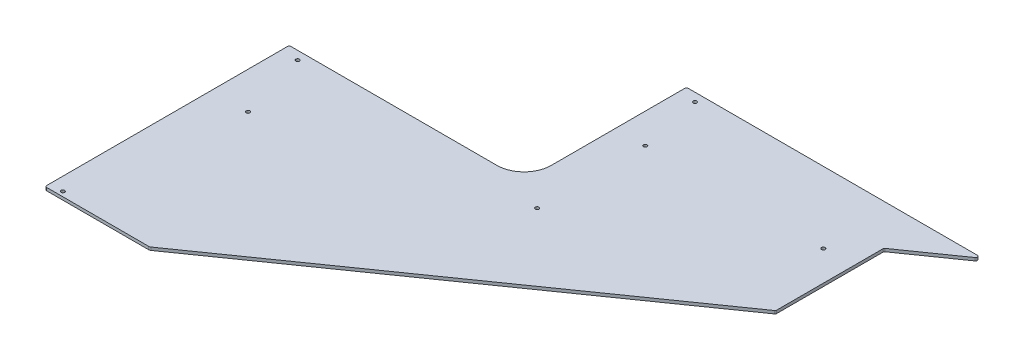
ISO-10303-21;
HEADER;
FILE_DESCRIPTION(('STEP AP214'),'2;1');
FILE_NAME('part.step','',(''),(''),'','','');
FILE_SCHEMA(('AUTOMOTIVE_DESIGN { 1 0 10303 214 1 1 1 1 }'));
ENDSEC;
DATA;
#1=APPLICATION_CONTEXT('core data for automotive mechanical design processes');
#2=APPLICATION_PROTOCOL_DEFINITION('international standard','automotive_design',2000,#1);
#3=PRODUCT_CONTEXT('',#1,'mechanical');
#4=PRODUCT('Part','Part','',(#3));
#5=PRODUCT_RELATED_PRODUCT_CATEGORY('part','',(#4));
#6=PRODUCT_DEFINITION_FORMATION('','',#4);
#7=PRODUCT_DEFINITION_CONTEXT('part definition',#1,'design');
#8=PRODUCT_DEFINITION('design','',#6,#7);
#9=PRODUCT_DEFINITION_SHAPE('','',#8);
#10=(LENGTH_UNIT() NAMED_UNIT(*) SI_UNIT(.MILLI.,.METRE.));
#11=(NAMED_UNIT(*) PLANE_ANGLE_UNIT() SI_UNIT($,.RADIAN.));
#12=(NAMED_UNIT(*) SI_UNIT($,.STERADIAN.) SOLID_ANGLE_UNIT());
#13=UNCERTAINTY_MEASURE_WITH_UNIT(LENGTH_MEASURE(1.E-05),#10,'distance_accuracy_value','');
#14=(GEOMETRIC_REPRESENTATION_CONTEXT(3) GLOBAL_UNCERTAINTY_ASSIGNED_CONTEXT((#13)) GLOBAL_UNIT_ASSIGNED_CONTEXT((#10,
#11,#12)) REPRESENTATION_CONTEXT('',''));
#15=CARTESIAN_POINT('',(0.,0.,0.));
#16=DIRECTION('',(0.,0.,1.));
#17=DIRECTION('',(1.,0.,0.));
#18=AXIS2_PLACEMENT_3D('',#15,#16,#17);
#19=CARTESIAN_POINT('',(0.,5.588,0.));
#20=DIRECTION('',(1.,0.,0.));
#21=DIRECTION('',(0.,0.,-1.));
#22=AXIS2_PLACEMENT_3D('',#19,#20,#21);
#23=PLANE('',#22);
#24=DIRECTION('',(0.,1.,0.));
#25=VECTOR('',#24,1.);
#26=CARTESIAN_POINT('',(0.,0.,-15.875));
#27=LINE('',#26,#25);
#28=CARTESIAN_POINT('',(0.,0.,-15.875));
#29=VERTEX_POINT('',#28);
#30=CARTESIAN_POINT('',(0.,5.588,-15.875));
#31=VERTEX_POINT('',#30);
#32=EDGE_CURVE('E284',#29,#31,#27,.T.);
#33=ORIENTED_EDGE('',*,*,#32,.T.);
#34=DIRECTION('',(0.,0.,1.));
#35=VECTOR('',#34,1.);
#36=CARTESIAN_POINT('',(0.,5.588,0.));
#37=LINE('',#36,#35);
#38=CARTESIAN_POINT('',(0.,5.588,-466.725));
#39=VERTEX_POINT('',#38);
#40=EDGE_CURVE('E184',#39,#31,#37,.T.);
#41=ORIENTED_EDGE('',*,*,#40,.F.);
#42=DIRECTION('',(0.,-1.,0.));
#43=VECTOR('',#42,1.);
#44=CARTESIAN_POINT('',(0.,5.588,-466.725));
#45=LINE('',#44,#43);
#46=CARTESIAN_POINT('',(0.,0.,-466.725));
#47=VERTEX_POINT('',#46);
#48=EDGE_CURVE('E240',#39,#47,#45,.T.);
#49=ORIENTED_EDGE('',*,*,#48,.T.);
#50=DIRECTION('',(0.,0.,1.));
#51=VECTOR('',#50,1.);
#52=CARTESIAN_POINT('',(0.,0.,0.));
#53=LINE('',#52,#51);
#54=EDGE_CURVE('E197',#47,#29,#53,.T.);
#55=ORIENTED_EDGE('',*,*,#54,.T.);
#56=EDGE_LOOP('',(#33,#41,#49,#55));
#57=FACE_BOUND('',#56,.T.);
#58=ADVANCED_FACE('F33',(#57),#23,.F.);
#59=CARTESIAN_POINT('',(0.,5.588,0.));
#60=DIRECTION('',(0.,-1.,0.));
#61=DIRECTION('',(0.,0.,-1.));
#62=AXIS2_PLACEMENT_3D('',#59,#60,#61);
#63=PLANE('',#62);
#64=CARTESIAN_POINT('',(471.4875,5.588,-758.063));
#65=DIRECTION('',(0.,1.,0.));
#66=DIRECTION('',(0.,0.,1.));
#67=AXIS2_PLACEMENT_3D('',#64,#65,#66);
#68=CIRCLE('',#67,3.37819999999999);
#69=CARTESIAN_POINT('',(471.4875,5.588,-754.6848));
#70=VERTEX_POINT('',#69);
#71=EDGE_CURVE('E557',#70,#70,#68,.T.);
#72=ORIENTED_EDGE('',*,*,#71,.F.);
#73=EDGE_LOOP('',(#72));
#74=FACE_BOUND('',#73,.T.);
#75=CARTESIAN_POINT('',(31.75,5.588,-454.025));
#76=DIRECTION('',(0.,1.,0.));
#77=DIRECTION('',(0.,0.,1.));
#78=AXIS2_PLACEMENT_3D('',#75,#76,#77);
#79=CIRCLE('',#78,3.3782);
#80=CARTESIAN_POINT('',(31.75,5.588,-450.6468));
#81=VERTEX_POINT('',#80);
#82=EDGE_CURVE('E550',#81,#81,#79,.T.);
#83=ORIENTED_EDGE('',*,*,#82,.F.);
#84=EDGE_LOOP('',(#83));
#85=FACE_BOUND('',#84,.T.);
#86=ORIENTED_EDGE('',*,*,#40,.T.);
#87=CARTESIAN_POINT('',(3.17500000000001,5.588,-15.875));
#88=DIRECTION('',(0.,-1.,0.));
#89=DIRECTION('',(0.,0.,1.));
#90=AXIS2_PLACEMENT_3D('',#87,#88,#89);
#91=CIRCLE('',#90,3.17500000000001);
#92=CARTESIAN_POINT('',(3.17500000000001,5.588,-12.7));
#93=VERTEX_POINT('',#92);
#94=EDGE_CURVE('E48',#93,#31,#91,.T.);
#95=ORIENTED_EDGE('',*,*,#94,.F.);
#96=DIRECTION('',(-1.,0.,0.));
#97=VECTOR('',#96,1.);
#98=CARTESIAN_POINT('',(3.17500000000001,5.588,-12.7));
#99=LINE('',#98,#97);
#100=CARTESIAN_POINT('',(193.935332376243,5.588,-12.7));
#101=VERTEX_POINT('',#100);
#102=EDGE_CURVE('E541',#101,#93,#99,.T.);
#103=ORIENTED_EDGE('',*,*,#102,.F.);
#104=CARTESIAN_POINT('',(193.935332376243,5.588,-19.05));
#105=DIRECTION('',(0.,-1.,0.));
#106=DIRECTION('',(0.,0.,1.));
#107=AXIS2_PLACEMENT_3D('',#104,#105,#106);
#108=CIRCLE('',#107,6.35);
#109=CARTESIAN_POINT('',(197.577542747072,5.588,-13.8483845187649));
#110=VERTEX_POINT('',#109);
#111=EDGE_CURVE('E388',#110,#101,#108,.T.);
#112=ORIENTED_EDGE('',*,*,#111,.F.);
#113=DIRECTION('',(0.819152044288991,0.,-0.573576436351047));
#114=VECTOR('',#113,1.);
#115=CARTESIAN_POINT('',(885.3805,5.588,-495.453199990197));
#116=LINE('',#115,#114);
#117=CARTESIAN_POINT('',(884.026605185414,5.588,-494.505192635081));
#118=VERTEX_POINT('',#117);
#119=EDGE_CURVE('E165',#110,#118,#116,.T.);
#120=ORIENTED_EDGE('',*,*,#119,.T.);
#121=CARTESIAN_POINT('',(882.2055,5.588,-497.106000375699));
#122=DIRECTION('',(0.,-1.,0.));
#123=DIRECTION('',(0.,0.,-1.));
#124=AXIS2_PLACEMENT_3D('',#121,#122,#123);
#125=CIRCLE('',#124,3.175);
#126=CARTESIAN_POINT('',(885.3805,5.588,-497.106000375699));
#127=VERTEX_POINT('',#126);
#128=EDGE_CURVE('E228',#118,#127,#125,.F.);
#129=ORIENTED_EDGE('',*,*,#128,.T.);
#130=DIRECTION('',(0.,0.,-1.));
#131=VECTOR('',#130,1.);
#132=CARTESIAN_POINT('',(885.3805,5.588,-697.738));
#133=LINE('',#132,#131);
#134=CARTESIAN_POINT('',(885.3805,5.588,-696.085199614498));
#135=VERTEX_POINT('',#134);
#136=EDGE_CURVE('E266',#127,#135,#133,.T.);
#137=ORIENTED_EDGE('',*,*,#136,.T.);
#138=CARTESIAN_POINT('',(888.5555,5.588,-696.085199614498));
#139=DIRECTION('',(0.,-1.,0.));
#140=DIRECTION('',(0.,0.,-1.));
#141=AXIS2_PLACEMENT_3D('',#138,#139,#140);
#142=CIRCLE('',#141,3.175);
#143=CARTESIAN_POINT('',(886.734394814585,5.588,-698.686007355116));
#144=VERTEX_POINT('',#143);
#145=EDGE_CURVE('E11',#135,#144,#142,.T.);
#146=ORIENTED_EDGE('',*,*,#145,.T.);
#147=DIRECTION('',(0.819152044288993,0.,-0.573576436351045));
#148=VECTOR('',#147,1.);
#149=CARTESIAN_POINT('',(994.20537811375,5.588,-773.938));
#150=LINE('',#149,#148);
#151=CARTESIAN_POINT('',(985.956669801661,5.588,-768.162192259383));
#152=VERTEX_POINT('',#151);
#153=EDGE_CURVE('E264',#144,#152,#150,.T.);
#154=ORIENTED_EDGE('',*,*,#153,.T.);
#155=CARTESIAN_POINT('',(984.135564616246,5.588,-770.763));
#156=DIRECTION('',(0.,-1.,0.));
#157=DIRECTION('',(0.,0.,-1.));
#158=AXIS2_PLACEMENT_3D('',#155,#156,#157);
#159=CIRCLE('',#158,3.175);
#160=CARTESIAN_POINT('',(984.135564616246,5.588,-773.938));
#161=VERTEX_POINT('',#160);
#162=EDGE_CURVE('E233',#152,#161,#159,.F.);
#163=ORIENTED_EDGE('',*,*,#162,.T.);
#164=DIRECTION('',(-1.,0.,0.));
#165=VECTOR('',#164,1.);
#166=CARTESIAN_POINT('',(439.7375,5.588,-773.938));
#167=LINE('',#166,#165);
#168=CARTESIAN_POINT('',(442.9125,5.588,-773.938));
#169=VERTEX_POINT('',#168);
#170=EDGE_CURVE('E270',#161,#169,#167,.T.);
#171=ORIENTED_EDGE('',*,*,#170,.T.);
#172=CARTESIAN_POINT('',(442.9125,5.588,-770.763));
#173=DIRECTION('',(0.,-1.,0.));
#174=DIRECTION('',(0.,0.,-1.));
#175=AXIS2_PLACEMENT_3D('',#172,#173,#174);
#176=CIRCLE('',#175,3.175);
#177=CARTESIAN_POINT('',(439.7375,5.588,-770.763));
#178=VERTEX_POINT('',#177);
#179=EDGE_CURVE('E230',#169,#178,#176,.F.);
#180=ORIENTED_EDGE('',*,*,#179,.T.);
#181=DIRECTION('',(0.,0.,1.));
#182=VECTOR('',#181,1.);
#183=CARTESIAN_POINT('',(439.7375,5.588,-469.9));
#184=LINE('',#183,#182);
#185=CARTESIAN_POINT('',(439.7375,5.588,-520.7));
#186=VERTEX_POINT('',#185);
#187=EDGE_CURVE('E273',#178,#186,#184,.T.);
#188=ORIENTED_EDGE('',*,*,#187,.T.);
#189=CARTESIAN_POINT('',(388.9375,5.588,-520.7));
#190=DIRECTION('',(0.,-1.,0.));
#191=DIRECTION('',(0.,0.,-1.));
#192=AXIS2_PLACEMENT_3D('',#189,#190,#191);
#193=CIRCLE('',#192,50.8);
#194=CARTESIAN_POINT('',(388.9375,5.588,-469.9));
#195=VERTEX_POINT('',#194);
#196=EDGE_CURVE('E209',#186,#195,#193,.T.);
#197=ORIENTED_EDGE('',*,*,#196,.T.);
#198=DIRECTION('',(-1.,0.,0.));
#199=VECTOR('',#198,1.);
#200=CARTESIAN_POINT('',(0.,5.588,-469.9));
#201=LINE('',#200,#199);
#202=CARTESIAN_POINT('',(3.175,5.588,-469.9));
#203=VERTEX_POINT('',#202);
#204=EDGE_CURVE('E278',#195,#203,#201,.T.);
#205=ORIENTED_EDGE('',*,*,#204,.T.);
#206=CARTESIAN_POINT('',(3.175,5.588,-466.725));
#207=DIRECTION('',(0.,-1.,0.));
#208=DIRECTION('',(0.,0.,-1.));
#209=AXIS2_PLACEMENT_3D('',#206,#207,#208);
#210=CIRCLE('',#209,3.175);
#211=EDGE_CURVE('E56',#203,#39,#210,.F.);
#212=ORIENTED_EDGE('',*,*,#211,.T.);
#213=EDGE_LOOP('',(#86,#95,#103,#112,#120,#129,#137,#146,#154,#163,#171,#180,#188,#197,#205,#212));
#214=FACE_BOUND('',#213,.T.);
#215=CARTESIAN_POINT('',(495.8715,5.588,-438.15));
#216=DIRECTION('',(0.,1.,0.));
#217=DIRECTION('',(0.,0.,1.));
#218=AXIS2_PLACEMENT_3D('',#215,#216,#217);
#219=CIRCLE('',#218,3.37819999999999);
#220=CARTESIAN_POINT('',(495.8715,5.588,-434.7718));
#221=VERTEX_POINT('',#220);
#222=EDGE_CURVE('E175',#221,#221,#219,.T.);
#223=ORIENTED_EDGE('',*,*,#222,.F.);
#224=EDGE_LOOP('',(#223));
#225=FACE_BOUND('',#224,.T.);
#226=CARTESIAN_POINT('',(24.6253,5.588,-21.463));
#227=DIRECTION('',(0.,1.,0.));
#228=DIRECTION('',(0.,0.,1.));
#229=AXIS2_PLACEMENT_3D('',#226,#227,#228);
#230=CIRCLE('',#229,3.3782);
#231=CARTESIAN_POINT('',(24.6253,5.588,-18.0848));
#232=VERTEX_POINT('',#231);
#233=EDGE_CURVE('E381',#232,#232,#230,.T.);
#234=ORIENTED_EDGE('',*,*,#233,.F.);
#235=EDGE_LOOP('',(#234));
#236=FACE_BOUND('',#235,.T.);
#237=CARTESIAN_POINT('',(495.8715,5.588,-640.588));
#238=DIRECTION('',(0.,1.,0.));
#239=DIRECTION('',(0.,0.,1.));
#240=AXIS2_PLACEMENT_3D('',#237,#238,#239);
#241=CIRCLE('',#240,3.37819999999999);
#242=CARTESIAN_POINT('',(495.8715,5.588,-637.2098));
#243=VERTEX_POINT('',#242);
#244=EDGE_CURVE('E576',#243,#243,#241,.T.);
#245=ORIENTED_EDGE('',*,*,#244,.F.);
#246=EDGE_LOOP('',(#245));
#247=FACE_BOUND('',#246,.T.);
#248=CARTESIAN_POINT('',(69.0753,5.588,-323.85));
#249=DIRECTION('',(0.,1.,0.));
#250=DIRECTION('',(0.,0.,1.));
#251=AXIS2_PLACEMENT_3D('',#248,#249,#250);
#252=CIRCLE('',#251,3.37819999999999);
#253=CARTESIAN_POINT('',(69.0753,5.588,-320.4718));
#254=VERTEX_POINT('',#253);
#255=EDGE_CURVE('E570',#254,#254,#252,.T.);
#256=ORIENTED_EDGE('',*,*,#255,.F.);
#257=EDGE_LOOP('',(#256));
#258=FACE_BOUND('',#257,.T.);
#259=CARTESIAN_POINT('',(829.2465,5.588,-640.588));
#260=DIRECTION('',(0.,1.,0.));
#261=DIRECTION('',(0.,0.,1.));
#262=AXIS2_PLACEMENT_3D('',#259,#260,#261);
#263=CIRCLE('',#262,3.37819999999999);
#264=CARTESIAN_POINT('',(829.2465,5.588,-637.2098));
#265=VERTEX_POINT('',#264);
#266=EDGE_CURVE('E565',#265,#265,#263,.T.);
#267=ORIENTED_EDGE('',*,*,#266,.F.);
#268=EDGE_LOOP('',(#267));
#269=FACE_BOUND('',#268,.T.);
#270=ADVANCED_FACE('F262',(#74,#85,#214,#225,#236,#247,#258,#269),#63,.F.);
#271=CARTESIAN_POINT('',(0.,0.,0.));
#272=DIRECTION('',(0.,-1.,0.));
#273=DIRECTION('',(0.,0.,-1.));
#274=AXIS2_PLACEMENT_3D('',#271,#272,#273);
#275=PLANE('',#274);
#276=CARTESIAN_POINT('',(3.17500000000001,0.,-15.875));
#277=DIRECTION('',(0.,-1.,0.));
#278=DIRECTION('',(0.,0.,1.));
#279=AXIS2_PLACEMENT_3D('',#276,#277,#278);
#280=CIRCLE('',#279,3.17500000000001);
#281=CARTESIAN_POINT('',(3.17500000000001,0.,-12.7));
#282=VERTEX_POINT('',#281);
#283=EDGE_CURVE('E166',#282,#29,#280,.T.);
#284=ORIENTED_EDGE('',*,*,#283,.T.);
#285=ORIENTED_EDGE('',*,*,#54,.F.);
#286=CARTESIAN_POINT('',(3.175,0.,-466.725));
#287=DIRECTION('',(0.,-1.,0.));
#288=DIRECTION('',(0.,0.,-1.));
#289=AXIS2_PLACEMENT_3D('',#286,#287,#288);
#290=CIRCLE('',#289,3.175);
#291=CARTESIAN_POINT('',(3.175,0.,-469.9));
#292=VERTEX_POINT('',#291);
#293=EDGE_CURVE('E219',#47,#292,#290,.T.);
#294=ORIENTED_EDGE('',*,*,#293,.T.);
#295=DIRECTION('',(-1.,0.,0.));
#296=VECTOR('',#295,1.);
#297=CARTESIAN_POINT('',(0.,0.,-469.9));
#298=LINE('',#297,#296);
#299=CARTESIAN_POINT('',(388.9375,0.,-469.9));
#300=VERTEX_POINT('',#299);
#301=EDGE_CURVE('E194',#300,#292,#298,.T.);
#302=ORIENTED_EDGE('',*,*,#301,.F.);
#303=CARTESIAN_POINT('',(388.9375,0.,-520.7));
#304=DIRECTION('',(0.,-1.,0.));
#305=DIRECTION('',(0.,0.,-1.));
#306=AXIS2_PLACEMENT_3D('',#303,#304,#305);
#307=CIRCLE('',#306,50.8);
#308=CARTESIAN_POINT('',(439.7375,0.,-520.7));
#309=VERTEX_POINT('',#308);
#310=EDGE_CURVE('E206',#300,#309,#307,.F.);
#311=ORIENTED_EDGE('',*,*,#310,.T.);
#312=DIRECTION('',(0.,0.,1.));
#313=VECTOR('',#312,1.);
#314=CARTESIAN_POINT('',(439.7375,0.,-469.9));
#315=LINE('',#314,#313);
#316=CARTESIAN_POINT('',(439.7375,0.,-770.763));
#317=VERTEX_POINT('',#316);
#318=EDGE_CURVE('E192',#317,#309,#315,.T.);
#319=ORIENTED_EDGE('',*,*,#318,.F.);
#320=CARTESIAN_POINT('',(442.9125,0.,-770.763));
#321=DIRECTION('',(0.,-1.,0.));
#322=DIRECTION('',(0.,0.,-1.));
#323=AXIS2_PLACEMENT_3D('',#320,#321,#322);
#324=CIRCLE('',#323,3.175);
#325=CARTESIAN_POINT('',(442.9125,0.,-773.938));
#326=VERTEX_POINT('',#325);
#327=EDGE_CURVE('E217',#317,#326,#324,.T.);
#328=ORIENTED_EDGE('',*,*,#327,.T.);
#329=DIRECTION('',(-1.,0.,0.));
#330=VECTOR('',#329,1.);
#331=CARTESIAN_POINT('',(439.7375,0.,-773.938));
#332=LINE('',#331,#330);
#333=CARTESIAN_POINT('',(984.135564616246,0.,-773.938));
#334=VERTEX_POINT('',#333);
#335=EDGE_CURVE('E189',#334,#326,#332,.T.);
#336=ORIENTED_EDGE('',*,*,#335,.F.);
#337=CARTESIAN_POINT('',(984.135564616246,0.,-770.763));
#338=DIRECTION('',(0.,-1.,0.));
#339=DIRECTION('',(0.,0.,-1.));
#340=AXIS2_PLACEMENT_3D('',#337,#338,#339);
#341=CIRCLE('',#340,3.175);
#342=CARTESIAN_POINT('',(985.956669801661,0.,-768.162192259383));
#343=VERTEX_POINT('',#342);
#344=EDGE_CURVE('E221',#334,#343,#341,.T.);
#345=ORIENTED_EDGE('',*,*,#344,.T.);
#346=DIRECTION('',(0.819152044288993,0.,-0.573576436351045));
#347=VECTOR('',#346,1.);
#348=CARTESIAN_POINT('',(994.20537811375,0.,-773.938));
#349=LINE('',#348,#347);
#350=CARTESIAN_POINT('',(886.734394814585,0.,-698.686007355116));
#351=VERTEX_POINT('',#350);
#352=EDGE_CURVE('E178',#351,#343,#349,.T.);
#353=ORIENTED_EDGE('',*,*,#352,.F.);
#354=CARTESIAN_POINT('',(888.5555,0.,-696.085199614498));
#355=DIRECTION('',(0.,-1.,0.));
#356=DIRECTION('',(0.,0.,-1.));
#357=AXIS2_PLACEMENT_3D('',#354,#355,#356);
#358=CIRCLE('',#357,3.175);
#359=CARTESIAN_POINT('',(885.3805,0.,-696.085199614498));
#360=VERTEX_POINT('',#359);
#361=EDGE_CURVE('E41',#351,#360,#358,.F.);
#362=ORIENTED_EDGE('',*,*,#361,.T.);
#363=DIRECTION('',(0.,0.,-1.));
#364=VECTOR('',#363,1.);
#365=CARTESIAN_POINT('',(885.3805,0.,-697.738));
#366=LINE('',#365,#364);
#367=CARTESIAN_POINT('',(885.3805,0.,-497.106000375699));
#368=VERTEX_POINT('',#367);
#369=EDGE_CURVE('E174',#368,#360,#366,.T.);
#370=ORIENTED_EDGE('',*,*,#369,.F.);
#371=CARTESIAN_POINT('',(882.2055,0.,-497.106000375699));
#372=DIRECTION('',(0.,-1.,0.));
#373=DIRECTION('',(0.,0.,-1.));
#374=AXIS2_PLACEMENT_3D('',#371,#372,#373);
#375=CIRCLE('',#374,3.175);
#376=CARTESIAN_POINT('',(884.026605185414,0.,-494.505192635081));
#377=VERTEX_POINT('',#376);
#378=EDGE_CURVE('E172',#368,#377,#375,.T.);
#379=ORIENTED_EDGE('',*,*,#378,.T.);
#380=DIRECTION('',(0.819152044288991,0.,-0.573576436351047));
#381=VECTOR('',#380,1.);
#382=CARTESIAN_POINT('',(885.3805,0.,-495.453199990197));
#383=LINE('',#382,#381);
#384=CARTESIAN_POINT('',(197.577542747072,0.,-13.8483845187649));
#385=VERTEX_POINT('',#384);
#386=EDGE_CURVE('E163',#385,#377,#383,.T.);
#387=ORIENTED_EDGE('',*,*,#386,.F.);
#388=CARTESIAN_POINT('',(193.935332376243,0.,-19.05));
#389=DIRECTION('',(0.,-1.,0.));
#390=DIRECTION('',(0.,0.,1.));
#391=AXIS2_PLACEMENT_3D('',#388,#389,#390);
#392=CIRCLE('',#391,6.35);
#393=CARTESIAN_POINT('',(193.935332376243,0.,-12.7));
#394=VERTEX_POINT('',#393);
#395=EDGE_CURVE('E146',#385,#394,#392,.T.);
#396=ORIENTED_EDGE('',*,*,#395,.T.);
#397=DIRECTION('',(-1.,0.,0.));
#398=VECTOR('',#397,1.);
#399=CARTESIAN_POINT('',(3.17500000000001,0.,-12.7));
#400=LINE('',#399,#398);
#401=EDGE_CURVE('E157',#394,#282,#400,.T.);
#402=ORIENTED_EDGE('',*,*,#401,.T.);
#403=EDGE_LOOP('',(#284,#285,#294,#302,#311,#319,#328,#336,#345,#353,#362,#370,#379,#387,#396,#402));
#404=FACE_BOUND('',#403,.T.);
#405=CARTESIAN_POINT('',(471.4875,0.,-758.063));
#406=DIRECTION('',(0.,1.,0.));
#407=DIRECTION('',(0.,0.,1.));
#408=AXIS2_PLACEMENT_3D('',#405,#406,#407);
#409=CIRCLE('',#408,3.37819999999999);
#410=CARTESIAN_POINT('',(471.4875,0.,-754.6848));
#411=VERTEX_POINT('',#410);
#412=EDGE_CURVE('E553',#411,#411,#409,.T.);
#413=ORIENTED_EDGE('',*,*,#412,.T.);
#414=EDGE_LOOP('',(#413));
#415=FACE_BOUND('',#414,.T.);
#416=CARTESIAN_POINT('',(31.75,0.,-454.025));
#417=DIRECTION('',(0.,1.,0.));
#418=DIRECTION('',(0.,0.,1.));
#419=AXIS2_PLACEMENT_3D('',#416,#417,#418);
#420=CIRCLE('',#419,3.3782);
#421=CARTESIAN_POINT('',(31.75,0.,-450.6468));
#422=VERTEX_POINT('',#421);
#423=EDGE_CURVE('E560',#422,#422,#420,.T.);
#424=ORIENTED_EDGE('',*,*,#423,.T.);
#425=EDGE_LOOP('',(#424));
#426=FACE_BOUND('',#425,.T.);
#427=CARTESIAN_POINT('',(69.0753,0.,-323.85));
#428=DIRECTION('',(0.,1.,0.));
#429=DIRECTION('',(0.,0.,1.));
#430=AXIS2_PLACEMENT_3D('',#427,#428,#429);
#431=CIRCLE('',#430,3.37819999999999);
#432=CARTESIAN_POINT('',(69.0753,0.,-320.4718));
#433=VERTEX_POINT('',#432);
#434=EDGE_CURVE('E567',#433,#433,#431,.T.);
#435=ORIENTED_EDGE('',*,*,#434,.T.);
#436=EDGE_LOOP('',(#435));
#437=FACE_BOUND('',#436,.T.);
#438=CARTESIAN_POINT('',(24.6253,0.,-21.463));
#439=DIRECTION('',(0.,1.,0.));
#440=DIRECTION('',(0.,0.,1.));
#441=AXIS2_PLACEMENT_3D('',#438,#439,#440);
#442=CIRCLE('',#441,3.3782);
#443=CARTESIAN_POINT('',(24.6253,0.,-18.0848));
#444=VERTEX_POINT('',#443);
#445=EDGE_CURVE('E384',#444,#444,#442,.T.);
#446=ORIENTED_EDGE('',*,*,#445,.T.);
#447=EDGE_LOOP('',(#446));
#448=FACE_BOUND('',#447,.T.);
#449=CARTESIAN_POINT('',(495.8715,0.,-438.15));
#450=DIRECTION('',(0.,1.,0.));
#451=DIRECTION('',(0.,0.,1.));
#452=AXIS2_PLACEMENT_3D('',#449,#450,#451);
#453=CIRCLE('',#452,3.37819999999999);
#454=CARTESIAN_POINT('',(495.8715,0.,-434.7718));
#455=VERTEX_POINT('',#454);
#456=EDGE_CURVE('E181',#455,#455,#453,.T.);
#457=ORIENTED_EDGE('',*,*,#456,.T.);
#458=EDGE_LOOP('',(#457));
#459=FACE_BOUND('',#458,.T.);
#460=CARTESIAN_POINT('',(495.8715,0.,-640.588));
#461=DIRECTION('',(0.,1.,0.));
#462=DIRECTION('',(0.,0.,1.));
#463=AXIS2_PLACEMENT_3D('',#460,#461,#462);
#464=CIRCLE('',#463,3.37819999999999);
#465=CARTESIAN_POINT('',(495.8715,0.,-637.2098));
#466=VERTEX_POINT('',#465);
#467=EDGE_CURVE('E573',#466,#466,#464,.T.);
#468=ORIENTED_EDGE('',*,*,#467,.T.);
#469=EDGE_LOOP('',(#468));
#470=FACE_BOUND('',#469,.T.);
#471=CARTESIAN_POINT('',(829.2465,0.,-640.588));
#472=DIRECTION('',(0.,1.,0.));
#473=DIRECTION('',(0.,0.,1.));
#474=AXIS2_PLACEMENT_3D('',#471,#472,#473);
#475=CIRCLE('',#474,3.37819999999999);
#476=CARTESIAN_POINT('',(829.2465,0.,-637.2098));
#477=VERTEX_POINT('',#476);
#478=EDGE_CURVE('E556',#477,#477,#475,.T.);
#479=ORIENTED_EDGE('',*,*,#478,.T.);
#480=EDGE_LOOP('',(#479));
#481=FACE_BOUND('',#480,.T.);
#482=ADVANCED_FACE('F169',(#404,#415,#426,#437,#448,#459,#470,#481),#275,.T.);
#483=CARTESIAN_POINT('',(885.3805,5.588,-495.453199990197));
#484=DIRECTION('',(-0.573576436351047,0.,-0.819152044288991));
#485=DIRECTION('',(-0.819152044288991,0.,0.573576436351047));
#486=AXIS2_PLACEMENT_3D('',#483,#484,#485);
#487=PLANE('',#486);
#488=ORIENTED_EDGE('',*,*,#119,.F.);
#489=DIRECTION('',(0.,1.,0.));
#490=VECTOR('',#489,1.);
#491=CARTESIAN_POINT('',(197.577542747072,0.,-13.8483845187649));
#492=LINE('',#491,#490);
#493=EDGE_CURVE('E150',#385,#110,#492,.T.);
#494=ORIENTED_EDGE('',*,*,#493,.F.);
#495=ORIENTED_EDGE('',*,*,#386,.T.);
#496=DIRECTION('',(0.,-1.,0.));
#497=VECTOR('',#496,1.);
#498=CARTESIAN_POINT('',(884.026605185414,5.588,-494.505192635081));
#499=LINE('',#498,#497);
#500=EDGE_CURVE('E248',#377,#118,#499,.F.);
#501=ORIENTED_EDGE('',*,*,#500,.T.);
#502=EDGE_LOOP('',(#488,#494,#495,#501));
#503=FACE_BOUND('',#502,.T.);
#504=ADVANCED_FACE('F161',(#503),#487,.F.);
#505=CARTESIAN_POINT('',(885.3805,5.588,-697.738));
#506=DIRECTION('',(-1.,0.,0.));
#507=DIRECTION('',(0.,0.,1.));
#508=AXIS2_PLACEMENT_3D('',#505,#506,#507);
#509=PLANE('',#508);
#510=ORIENTED_EDGE('',*,*,#369,.T.);
#511=DIRECTION('',(0.,-1.,0.));
#512=VECTOR('',#511,1.);
#513=CARTESIAN_POINT('',(885.3805,5.588,-696.085199614498));
#514=LINE('',#513,#512);
#515=EDGE_CURVE('E238',#360,#135,#514,.F.);
#516=ORIENTED_EDGE('',*,*,#515,.T.);
#517=ORIENTED_EDGE('',*,*,#136,.F.);
#518=DIRECTION('',(0.,-1.,0.));
#519=VECTOR('',#518,1.);
#520=CARTESIAN_POINT('',(885.3805,5.588,-497.106000375699));
#521=LINE('',#520,#519);
#522=EDGE_CURVE('E235',#127,#368,#521,.T.);
#523=ORIENTED_EDGE('',*,*,#522,.T.);
#524=EDGE_LOOP('',(#510,#516,#517,#523));
#525=FACE_BOUND('',#524,.T.);
#526=ADVANCED_FACE('F254',(#525),#509,.F.);
#527=CARTESIAN_POINT('',(994.20537811375,5.588,-773.938));
#528=DIRECTION('',(-0.573576436351045,0.,-0.819152044288993));
#529=DIRECTION('',(-0.819152044288993,0.,0.573576436351045));
#530=AXIS2_PLACEMENT_3D('',#527,#528,#529);
#531=PLANE('',#530);
#532=ORIENTED_EDGE('',*,*,#352,.T.);
#533=DIRECTION('',(0.,-1.,0.));
#534=VECTOR('',#533,1.);
#535=CARTESIAN_POINT('',(985.956669801661,5.588,-768.162192259383));
#536=LINE('',#535,#534);
#537=EDGE_CURVE('E226',#343,#152,#536,.F.);
#538=ORIENTED_EDGE('',*,*,#537,.T.);
#539=ORIENTED_EDGE('',*,*,#153,.F.);
#540=DIRECTION('',(0.,-1.,0.));
#541=VECTOR('',#540,1.);
#542=CARTESIAN_POINT('',(886.734394814585,0.,-698.686007355116));
#543=LINE('',#542,#541);
#544=EDGE_CURVE('E223',#144,#351,#543,.T.);
#545=ORIENTED_EDGE('',*,*,#544,.T.);
#546=EDGE_LOOP('',(#532,#538,#539,#545));
#547=FACE_BOUND('',#546,.T.);
#548=ADVANCED_FACE('F268',(#547),#531,.F.);
#549=CARTESIAN_POINT('',(439.7375,5.588,-773.938));
#550=DIRECTION('',(0.,0.,1.));
#551=DIRECTION('',(1.,0.,0.));
#552=AXIS2_PLACEMENT_3D('',#549,#550,#551);
#553=PLANE('',#552);
#554=ORIENTED_EDGE('',*,*,#170,.F.);
#555=DIRECTION('',(0.,-1.,0.));
#556=VECTOR('',#555,1.);
#557=CARTESIAN_POINT('',(984.135564616246,5.588,-773.938));
#558=LINE('',#557,#556);
#559=EDGE_CURVE('E213',#161,#334,#558,.T.);
#560=ORIENTED_EDGE('',*,*,#559,.T.);
#561=ORIENTED_EDGE('',*,*,#335,.T.);
#562=DIRECTION('',(0.,-1.,0.));
#563=VECTOR('',#562,1.);
#564=CARTESIAN_POINT('',(442.9125,5.588,-773.938));
#565=LINE('',#564,#563);
#566=EDGE_CURVE('E211',#326,#169,#565,.F.);
#567=ORIENTED_EDGE('',*,*,#566,.T.);
#568=EDGE_LOOP('',(#554,#560,#561,#567));
#569=FACE_BOUND('',#568,.T.);
#570=ADVANCED_FACE('F308',(#569),#553,.F.);
#571=CARTESIAN_POINT('',(439.7375,5.588,-469.9));
#572=DIRECTION('',(1.,0.,0.));
#573=DIRECTION('',(0.,0.,-1.));
#574=AXIS2_PLACEMENT_3D('',#571,#572,#573);
#575=PLANE('',#574);
#576=ORIENTED_EDGE('',*,*,#187,.F.);
#577=DIRECTION('',(0.,-1.,0.));
#578=VECTOR('',#577,1.);
#579=CARTESIAN_POINT('',(439.7375,5.588,-770.763));
#580=LINE('',#579,#578);
#581=EDGE_CURVE('E245',#178,#317,#580,.T.);
#582=ORIENTED_EDGE('',*,*,#581,.T.);
#583=ORIENTED_EDGE('',*,*,#318,.T.);
#584=DIRECTION('',(0.,-1.,0.));
#585=VECTOR('',#584,1.);
#586=CARTESIAN_POINT('',(439.7375,5.588,-520.7));
#587=LINE('',#586,#585);
#588=EDGE_CURVE('E203',#309,#186,#587,.F.);
#589=ORIENTED_EDGE('',*,*,#588,.T.);
#590=EDGE_LOOP('',(#576,#582,#583,#589));
#591=FACE_BOUND('',#590,.T.);
#592=ADVANCED_FACE('F300',(#591),#575,.F.);
#593=CARTESIAN_POINT('',(0.,5.588,-469.9));
#594=DIRECTION('',(0.,0.,1.));
#595=DIRECTION('',(1.,0.,0.));
#596=AXIS2_PLACEMENT_3D('',#593,#594,#595);
#597=PLANE('',#596);
#598=ORIENTED_EDGE('',*,*,#301,.T.);
#599=DIRECTION('',(0.,-1.,0.));
#600=VECTOR('',#599,1.);
#601=CARTESIAN_POINT('',(3.175,5.588,-469.9));
#602=LINE('',#601,#600);
#603=EDGE_CURVE('E243',#292,#203,#602,.F.);
#604=ORIENTED_EDGE('',*,*,#603,.T.);
#605=ORIENTED_EDGE('',*,*,#204,.F.);
#606=DIRECTION('',(0.,-1.,0.));
#607=VECTOR('',#606,1.);
#608=CARTESIAN_POINT('',(388.9375,0.,-469.9));
#609=LINE('',#608,#607);
#610=EDGE_CURVE('E200',#195,#300,#609,.T.);
#611=ORIENTED_EDGE('',*,*,#610,.T.);
#612=EDGE_LOOP('',(#598,#604,#605,#611));
#613=FACE_BOUND('',#612,.T.);
#614=ADVANCED_FACE('F290',(#613),#597,.F.);
#615=CARTESIAN_POINT('',(495.8715,5.588,-438.15));
#616=DIRECTION('',(0.,-1.,0.));
#617=DIRECTION('',(0.,0.,-1.));
#618=AXIS2_PLACEMENT_3D('',#615,#616,#617);
#619=CYLINDRICAL_SURFACE('',#618,3.37819999999999);
#620=ORIENTED_EDGE('',*,*,#222,.T.);
#621=EDGE_LOOP('',(#620));
#622=FACE_BOUND('',#621,.T.);
#623=ORIENTED_EDGE('',*,*,#456,.F.);
#624=EDGE_LOOP('',(#623));
#625=FACE_BOUND('',#624,.T.);
#626=ADVANCED_FACE('F335',(#622,#625),#619,.F.);
#627=CARTESIAN_POINT('',(24.6253,5.588,-21.463));
#628=DIRECTION('',(0.,-1.,0.));
#629=DIRECTION('',(0.,0.,-1.));
#630=AXIS2_PLACEMENT_3D('',#627,#628,#629);
#631=CYLINDRICAL_SURFACE('',#630,3.3782);
#632=ORIENTED_EDGE('',*,*,#233,.T.);
#633=EDGE_LOOP('',(#632));
#634=FACE_BOUND('',#633,.T.);
#635=ORIENTED_EDGE('',*,*,#445,.F.);
#636=EDGE_LOOP('',(#635));
#637=FACE_BOUND('',#636,.T.);
#638=ADVANCED_FACE('F367',(#634,#637),#631,.F.);
#639=CARTESIAN_POINT('',(495.8715,5.588,-640.588));
#640=DIRECTION('',(0.,-1.,0.));
#641=DIRECTION('',(0.,0.,-1.));
#642=AXIS2_PLACEMENT_3D('',#639,#640,#641);
#643=CYLINDRICAL_SURFACE('',#642,3.37819999999999);
#644=ORIENTED_EDGE('',*,*,#244,.T.);
#645=EDGE_LOOP('',(#644));
#646=FACE_BOUND('',#645,.T.);
#647=ORIENTED_EDGE('',*,*,#467,.F.);
#648=EDGE_LOOP('',(#647));
#649=FACE_BOUND('',#648,.T.);
#650=ADVANCED_FACE('F359',(#646,#649),#643,.F.);
#651=CARTESIAN_POINT('',(69.0753,5.588,-323.85));
#652=DIRECTION('',(0.,-1.,0.));
#653=DIRECTION('',(0.,0.,-1.));
#654=AXIS2_PLACEMENT_3D('',#651,#652,#653);
#655=CYLINDRICAL_SURFACE('',#654,3.37819999999999);
#656=ORIENTED_EDGE('',*,*,#255,.T.);
#657=EDGE_LOOP('',(#656));
#658=FACE_BOUND('',#657,.T.);
#659=ORIENTED_EDGE('',*,*,#434,.F.);
#660=EDGE_LOOP('',(#659));
#661=FACE_BOUND('',#660,.T.);
#662=ADVANCED_FACE('F353',(#658,#661),#655,.F.);
#663=CARTESIAN_POINT('',(829.2465,5.588,-640.588));
#664=DIRECTION('',(0.,-1.,0.));
#665=DIRECTION('',(0.,0.,-1.));
#666=AXIS2_PLACEMENT_3D('',#663,#664,#665);
#667=CYLINDRICAL_SURFACE('',#666,3.37819999999999);
#668=ORIENTED_EDGE('',*,*,#266,.T.);
#669=EDGE_LOOP('',(#668));
#670=FACE_BOUND('',#669,.T.);
#671=ORIENTED_EDGE('',*,*,#478,.F.);
#672=EDGE_LOOP('',(#671));
#673=FACE_BOUND('',#672,.T.);
#674=ADVANCED_FACE('F346',(#670,#673),#667,.F.);
#675=CARTESIAN_POINT('',(388.9375,5.588,-520.7));
#676=DIRECTION('',(0.,1.,0.));
#677=DIRECTION('',(0.,0.,1.));
#678=AXIS2_PLACEMENT_3D('',#675,#676,#677);
#679=CYLINDRICAL_SURFACE('',#678,50.8);
#680=ORIENTED_EDGE('',*,*,#196,.F.);
#681=ORIENTED_EDGE('',*,*,#588,.F.);
#682=ORIENTED_EDGE('',*,*,#310,.F.);
#683=ORIENTED_EDGE('',*,*,#610,.F.);
#684=EDGE_LOOP('',(#680,#681,#682,#683));
#685=FACE_BOUND('',#684,.T.);
#686=ADVANCED_FACE('F294',(#685),#679,.F.);
#687=CARTESIAN_POINT('',(31.75,0.,-454.025));
#688=DIRECTION('',(0.,1.,0.));
#689=DIRECTION('',(0.,0.,1.));
#690=AXIS2_PLACEMENT_3D('',#687,#688,#689);
#691=CYLINDRICAL_SURFACE('',#690,3.3782);
#692=ORIENTED_EDGE('',*,*,#423,.F.);
#693=EDGE_LOOP('',(#692));
#694=FACE_BOUND('',#693,.T.);
#695=ORIENTED_EDGE('',*,*,#82,.T.);
#696=EDGE_LOOP('',(#695));
#697=FACE_BOUND('',#696,.T.);
#698=ADVANCED_FACE('F320',(#694,#697),#691,.F.);
#699=CARTESIAN_POINT('',(471.4875,0.,-758.063));
#700=DIRECTION('',(0.,1.,0.));
#701=DIRECTION('',(0.,0.,1.));
#702=AXIS2_PLACEMENT_3D('',#699,#700,#701);
#703=CYLINDRICAL_SURFACE('',#702,3.37819999999999);
#704=ORIENTED_EDGE('',*,*,#412,.F.);
#705=EDGE_LOOP('',(#704));
#706=FACE_BOUND('',#705,.T.);
#707=ORIENTED_EDGE('',*,*,#71,.T.);
#708=EDGE_LOOP('',(#707));
#709=FACE_BOUND('',#708,.T.);
#710=ADVANCED_FACE('F313',(#706,#709),#703,.F.);
#711=CARTESIAN_POINT('',(984.135564616246,5.588,-770.763));
#712=DIRECTION('',(0.,-1.,0.));
#713=DIRECTION('',(0.,0.,-1.));
#714=AXIS2_PLACEMENT_3D('',#711,#712,#713);
#715=CYLINDRICAL_SURFACE('',#714,3.175);
#716=ORIENTED_EDGE('',*,*,#162,.F.);
#717=ORIENTED_EDGE('',*,*,#537,.F.);
#718=ORIENTED_EDGE('',*,*,#344,.F.);
#719=ORIENTED_EDGE('',*,*,#559,.F.);
#720=EDGE_LOOP('',(#716,#717,#718,#719));
#721=FACE_BOUND('',#720,.T.);
#722=ADVANCED_FACE('F311',(#721),#715,.T.);
#723=CARTESIAN_POINT('',(888.5555,5.588,-696.085199614498));
#724=DIRECTION('',(0.,1.,0.));
#725=DIRECTION('',(0.,0.,1.));
#726=AXIS2_PLACEMENT_3D('',#723,#724,#725);
#727=CYLINDRICAL_SURFACE('',#726,3.175);
#728=ORIENTED_EDGE('',*,*,#145,.F.);
#729=ORIENTED_EDGE('',*,*,#515,.F.);
#730=ORIENTED_EDGE('',*,*,#361,.F.);
#731=ORIENTED_EDGE('',*,*,#544,.F.);
#732=EDGE_LOOP('',(#728,#729,#730,#731));
#733=FACE_BOUND('',#732,.T.);
#734=ADVANCED_FACE('F259',(#733),#727,.F.);
#735=CARTESIAN_POINT('',(3.175,5.588,-466.725));
#736=DIRECTION('',(0.,-1.,0.));
#737=DIRECTION('',(0.,0.,-1.));
#738=AXIS2_PLACEMENT_3D('',#735,#736,#737);
#739=CYLINDRICAL_SURFACE('',#738,3.175);
#740=ORIENTED_EDGE('',*,*,#211,.F.);
#741=ORIENTED_EDGE('',*,*,#603,.F.);
#742=ORIENTED_EDGE('',*,*,#293,.F.);
#743=ORIENTED_EDGE('',*,*,#48,.F.);
#744=EDGE_LOOP('',(#740,#741,#742,#743));
#745=FACE_BOUND('',#744,.T.);
#746=ADVANCED_FACE('F286',(#745),#739,.T.);
#747=CARTESIAN_POINT('',(442.9125,5.588,-770.763));
#748=DIRECTION('',(0.,-1.,0.));
#749=DIRECTION('',(0.,0.,-1.));
#750=AXIS2_PLACEMENT_3D('',#747,#748,#749);
#751=CYLINDRICAL_SURFACE('',#750,3.175);
#752=ORIENTED_EDGE('',*,*,#179,.F.);
#753=ORIENTED_EDGE('',*,*,#566,.F.);
#754=ORIENTED_EDGE('',*,*,#327,.F.);
#755=ORIENTED_EDGE('',*,*,#581,.F.);
#756=EDGE_LOOP('',(#752,#753,#754,#755));
#757=FACE_BOUND('',#756,.T.);
#758=ADVANCED_FACE('F304',(#757),#751,.T.);
#759=CARTESIAN_POINT('',(882.2055,5.588,-497.106000375699));
#760=DIRECTION('',(0.,-1.,0.));
#761=DIRECTION('',(0.,0.,-1.));
#762=AXIS2_PLACEMENT_3D('',#759,#760,#761);
#763=CYLINDRICAL_SURFACE('',#762,3.175);
#764=ORIENTED_EDGE('',*,*,#128,.F.);
#765=ORIENTED_EDGE('',*,*,#500,.F.);
#766=ORIENTED_EDGE('',*,*,#378,.F.);
#767=ORIENTED_EDGE('',*,*,#522,.F.);
#768=EDGE_LOOP('',(#764,#765,#766,#767));
#769=FACE_BOUND('',#768,.T.);
#770=ADVANCED_FACE('F35',(#769),#763,.T.);
#771=CARTESIAN_POINT('',(3.17500000000001,0.,-15.875));
#772=DIRECTION('',(0.,1.,0.));
#773=DIRECTION('',(0.,0.,1.));
#774=AXIS2_PLACEMENT_3D('',#771,#772,#773);
#775=CYLINDRICAL_SURFACE('',#774,3.17500000000001);
#776=ORIENTED_EDGE('',*,*,#94,.T.);
#777=ORIENTED_EDGE('',*,*,#32,.F.);
#778=ORIENTED_EDGE('',*,*,#283,.F.);
#779=DIRECTION('',(0.,1.,0.));
#780=VECTOR('',#779,1.);
#781=CARTESIAN_POINT('',(3.17500000000001,0.,-12.7));
#782=LINE('',#781,#780);
#783=EDGE_CURVE('E542',#282,#93,#782,.T.);
#784=ORIENTED_EDGE('',*,*,#783,.T.);
#785=EDGE_LOOP('',(#776,#777,#778,#784));
#786=FACE_BOUND('',#785,.T.);
#787=ADVANCED_FACE('F391',(#786),#775,.T.);
#788=CARTESIAN_POINT('',(3.17500000000001,0.,-12.7));
#789=DIRECTION('',(0.,0.,-1.));
#790=DIRECTION('',(-1.,0.,0.));
#791=AXIS2_PLACEMENT_3D('',#788,#789,#790);
#792=PLANE('',#791);
#793=ORIENTED_EDGE('',*,*,#102,.T.);
#794=ORIENTED_EDGE('',*,*,#783,.F.);
#795=ORIENTED_EDGE('',*,*,#401,.F.);
#796=DIRECTION('',(0.,1.,0.));
#797=VECTOR('',#796,1.);
#798=CARTESIAN_POINT('',(193.935332376243,0.,-12.7));
#799=LINE('',#798,#797);
#800=EDGE_CURVE('E152',#394,#101,#799,.T.);
#801=ORIENTED_EDGE('',*,*,#800,.T.);
#802=EDGE_LOOP('',(#793,#794,#795,#801));
#803=FACE_BOUND('',#802,.T.);
#804=ADVANCED_FACE('F396',(#803),#792,.F.);
#805=CARTESIAN_POINT('',(193.935332376243,0.,-19.05));
#806=DIRECTION('',(0.,1.,0.));
#807=DIRECTION('',(0.,0.,1.));
#808=AXIS2_PLACEMENT_3D('',#805,#806,#807);
#809=CYLINDRICAL_SURFACE('',#808,6.35);
#810=ORIENTED_EDGE('',*,*,#111,.T.);
#811=ORIENTED_EDGE('',*,*,#800,.F.);
#812=ORIENTED_EDGE('',*,*,#395,.F.);
#813=ORIENTED_EDGE('',*,*,#493,.T.);
#814=EDGE_LOOP('',(#810,#811,#812,#813));
#815=FACE_BOUND('',#814,.T.);
#816=ADVANCED_FACE('F149',(#815),#809,.T.);
#817=CLOSED_SHELL('',(#58,#270,#482,#504,#526,#548,#570,#592,#614,#626,#638,#650,#662,#674,#686,
#698,#710,#722,#734,#746,#758,#770,#787,#804,#816));
#818=MANIFOLD_SOLID_BREP('B2',#817);
#819=ADVANCED_BREP_SHAPE_REPRESENTATION('',(#18,#818),#14);
#820=SHAPE_DEFINITION_REPRESENTATION(#9,#819);
ENDSEC;
END-ISO-10303-21;
